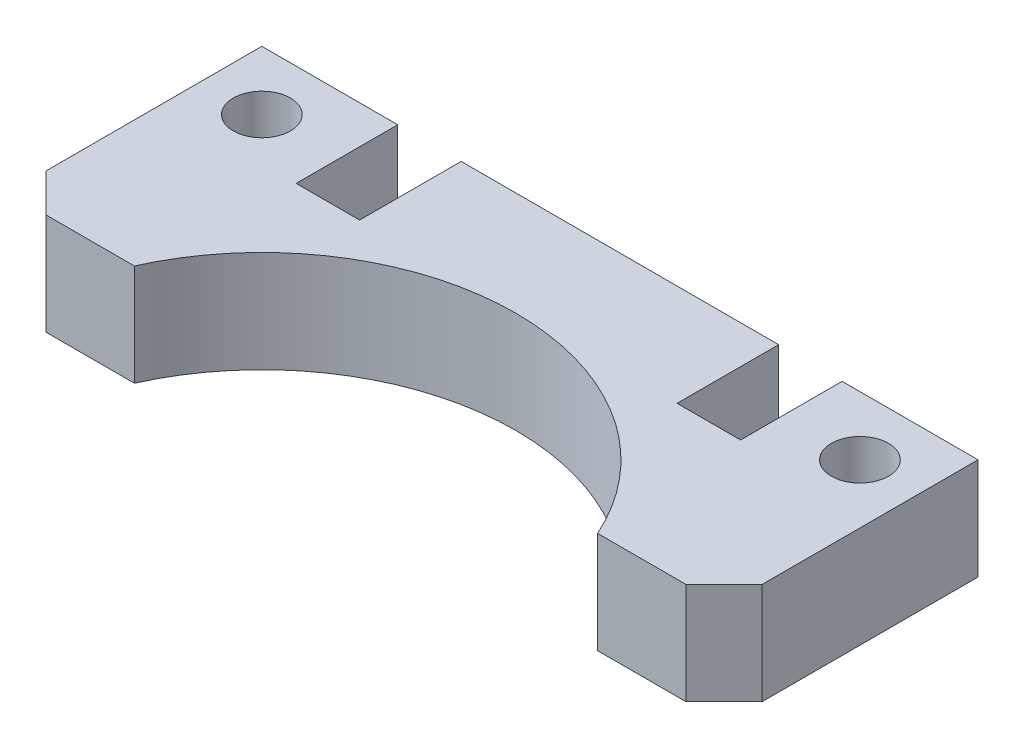
ISO-10303-21;
HEADER;
FILE_DESCRIPTION(('STEP AP214'),'2;1');
FILE_NAME('part.step','',(''),(''),'','','');
FILE_SCHEMA(('AUTOMOTIVE_DESIGN { 1 0 10303 214 1 1 1 1 }'));
ENDSEC;
DATA;
#1=APPLICATION_CONTEXT('core data for automotive mechanical design processes');
#2=APPLICATION_PROTOCOL_DEFINITION('international standard','automotive_design',2000,#1);
#3=PRODUCT_CONTEXT('',#1,'mechanical');
#4=PRODUCT('Part','Part','',(#3));
#5=PRODUCT_RELATED_PRODUCT_CATEGORY('part','',(#4));
#6=PRODUCT_DEFINITION_FORMATION('','',#4);
#7=PRODUCT_DEFINITION_CONTEXT('part definition',#1,'design');
#8=PRODUCT_DEFINITION('design','',#6,#7);
#9=PRODUCT_DEFINITION_SHAPE('','',#8);
#10=(LENGTH_UNIT() NAMED_UNIT(*) SI_UNIT(.MILLI.,.METRE.));
#11=(NAMED_UNIT(*) PLANE_ANGLE_UNIT() SI_UNIT($,.RADIAN.));
#12=(NAMED_UNIT(*) SI_UNIT($,.STERADIAN.) SOLID_ANGLE_UNIT());
#13=UNCERTAINTY_MEASURE_WITH_UNIT(LENGTH_MEASURE(1.E-05),#10,'distance_accuracy_value','');
#14=(GEOMETRIC_REPRESENTATION_CONTEXT(3) GLOBAL_UNCERTAINTY_ASSIGNED_CONTEXT((#13)) GLOBAL_UNIT_ASSIGNED_CONTEXT((#10,
#11,#12)) REPRESENTATION_CONTEXT('',''));
#15=CARTESIAN_POINT('',(0.,0.,0.));
#16=DIRECTION('',(0.,0.,1.));
#17=DIRECTION('',(1.,0.,0.));
#18=AXIS2_PLACEMENT_3D('',#15,#16,#17);
#19=CARTESIAN_POINT('',(0.,8.,-20.));
#20=DIRECTION('',(0.,0.,1.));
#21=DIRECTION('',(1.,0.,0.));
#22=AXIS2_PLACEMENT_3D('',#19,#20,#21);
#23=PLANE('',#22);
#24=DIRECTION('',(-1.,0.,0.));
#25=VECTOR('',#24,1.);
#26=CARTESIAN_POINT('',(0.,8.,-20.));
#27=LINE('',#26,#25);
#28=CARTESIAN_POINT('',(40.7,8.,-20.));
#29=VERTEX_POINT('',#28);
#30=CARTESIAN_POINT('',(15.7,8.,-20.));
#31=VERTEX_POINT('',#30);
#32=EDGE_CURVE('E247',#29,#31,#27,.T.);
#33=ORIENTED_EDGE('',*,*,#32,.F.);
#34=DIRECTION('',(0.,1.,0.));
#35=VECTOR('',#34,1.);
#36=CARTESIAN_POINT('',(40.7,0.,-20.));
#37=LINE('',#36,#35);
#38=CARTESIAN_POINT('',(40.7,0.,-20.));
#39=VERTEX_POINT('',#38);
#40=EDGE_CURVE('E177',#39,#29,#37,.T.);
#41=ORIENTED_EDGE('',*,*,#40,.F.);
#42=DIRECTION('',(-1.,0.,0.));
#43=VECTOR('',#42,1.);
#44=CARTESIAN_POINT('',(0.,0.,-20.));
#45=LINE('',#44,#43);
#46=CARTESIAN_POINT('',(15.7,0.,-20.));
#47=VERTEX_POINT('',#46);
#48=EDGE_CURVE('E168',#39,#47,#45,.T.);
#49=ORIENTED_EDGE('',*,*,#48,.T.);
#50=DIRECTION('',(0.,1.,0.));
#51=VECTOR('',#50,1.);
#52=CARTESIAN_POINT('',(15.7,0.,-20.));
#53=LINE('',#52,#51);
#54=EDGE_CURVE('E203',#47,#31,#53,.T.);
#55=ORIENTED_EDGE('',*,*,#54,.T.);
#56=EDGE_LOOP('',(#33,#41,#49,#55));
#57=FACE_BOUND('',#56,.T.);
#58=ADVANCED_FACE('F35',(#57),#23,.F.);
#59=CARTESIAN_POINT('',(10.7,8.,-20.));
#60=VERTEX_POINT('',#59);
#61=CARTESIAN_POINT('',(0.,8.,-20.));
#62=VERTEX_POINT('',#61);
#63=EDGE_CURVE('E242',#60,#62,#27,.T.);
#64=ORIENTED_EDGE('',*,*,#63,.F.);
#65=DIRECTION('',(0.,1.,0.));
#66=VECTOR('',#65,1.);
#67=CARTESIAN_POINT('',(10.7,0.,-20.));
#68=LINE('',#67,#66);
#69=CARTESIAN_POINT('',(10.7,0.,-20.));
#70=VERTEX_POINT('',#69);
#71=EDGE_CURVE('E200',#70,#60,#68,.T.);
#72=ORIENTED_EDGE('',*,*,#71,.F.);
#73=CARTESIAN_POINT('',(0.,0.,-20.));
#74=VERTEX_POINT('',#73);
#75=EDGE_CURVE('E256',#70,#74,#45,.T.);
#76=ORIENTED_EDGE('',*,*,#75,.T.);
#77=DIRECTION('',(0.,-1.,0.));
#78=VECTOR('',#77,1.);
#79=CARTESIAN_POINT('',(0.,8.,-20.));
#80=LINE('',#79,#78);
#81=EDGE_CURVE('E246',#62,#74,#80,.T.);
#82=ORIENTED_EDGE('',*,*,#81,.F.);
#83=EDGE_LOOP('',(#64,#72,#76,#82));
#84=FACE_BOUND('',#83,.T.);
#85=ADVANCED_FACE('F310',(#84),#23,.F.);
#86=CARTESIAN_POINT('',(0.,8.,0.));
#87=DIRECTION('',(0.,0.,-1.));
#88=DIRECTION('',(-1.,0.,0.));
#89=AXIS2_PLACEMENT_3D('',#86,#87,#88);
#90=PLANE('',#89);
#91=DIRECTION('',(1.,0.,0.));
#92=VECTOR('',#91,1.);
#93=CARTESIAN_POINT('',(0.,0.,0.));
#94=LINE('',#93,#92);
#95=CARTESIAN_POINT('',(3.,0.,0.));
#96=VERTEX_POINT('',#95);
#97=CARTESIAN_POINT('',(9.95828955388229,0.,0.));
#98=VERTEX_POINT('',#97);
#99=EDGE_CURVE('E251',#96,#98,#94,.T.);
#100=ORIENTED_EDGE('',*,*,#99,.T.);
#101=DIRECTION('',(0.,1.,0.));
#102=VECTOR('',#101,1.);
#103=CARTESIAN_POINT('',(9.95828955388229,0.,0.));
#104=LINE('',#103,#102);
#105=CARTESIAN_POINT('',(9.95828955388229,8.,0.));
#106=VERTEX_POINT('',#105);
#107=EDGE_CURVE('E216',#98,#106,#104,.T.);
#108=ORIENTED_EDGE('',*,*,#107,.T.);
#109=DIRECTION('',(1.,0.,0.));
#110=VECTOR('',#109,1.);
#111=CARTESIAN_POINT('',(0.,8.,0.));
#112=LINE('',#111,#110);
#113=CARTESIAN_POINT('',(3.,8.,0.));
#114=VERTEX_POINT('',#113);
#115=EDGE_CURVE('E237',#114,#106,#112,.T.);
#116=ORIENTED_EDGE('',*,*,#115,.F.);
#117=DIRECTION('',(0.,-1.,0.));
#118=VECTOR('',#117,1.);
#119=CARTESIAN_POINT('',(3.,8.,0.));
#120=LINE('',#119,#118);
#121=EDGE_CURVE('E272',#114,#96,#120,.T.);
#122=ORIENTED_EDGE('',*,*,#121,.T.);
#123=EDGE_LOOP('',(#100,#108,#116,#122));
#124=FACE_BOUND('',#123,.T.);
#125=ADVANCED_FACE('F316',(#124),#90,.F.);
#126=CARTESIAN_POINT('',(0.,8.,0.));
#127=DIRECTION('',(1.,0.,0.));
#128=DIRECTION('',(0.,0.,-1.));
#129=AXIS2_PLACEMENT_3D('',#126,#127,#128);
#130=PLANE('',#129);
#131=DIRECTION('',(0.,0.,1.));
#132=VECTOR('',#131,1.);
#133=CARTESIAN_POINT('',(0.,0.,0.));
#134=LINE('',#133,#132);
#135=CARTESIAN_POINT('',(0.,0.,-3.00000000000001));
#136=VERTEX_POINT('',#135);
#137=EDGE_CURVE('E229',#74,#136,#134,.T.);
#138=ORIENTED_EDGE('',*,*,#137,.T.);
#139=DIRECTION('',(0.,1.,0.));
#140=VECTOR('',#139,1.);
#141=CARTESIAN_POINT('',(0.,8.,-3.00000000000001));
#142=LINE('',#141,#140);
#143=CARTESIAN_POINT('',(0.,8.,-3.00000000000001));
#144=VERTEX_POINT('',#143);
#145=EDGE_CURVE('E11',#136,#144,#142,.T.);
#146=ORIENTED_EDGE('',*,*,#145,.T.);
#147=DIRECTION('',(0.,0.,1.));
#148=VECTOR('',#147,1.);
#149=CARTESIAN_POINT('',(0.,8.,0.));
#150=LINE('',#149,#148);
#151=EDGE_CURVE('E232',#62,#144,#150,.T.);
#152=ORIENTED_EDGE('',*,*,#151,.F.);
#153=ORIENTED_EDGE('',*,*,#81,.T.);
#154=EDGE_LOOP('',(#138,#146,#152,#153));
#155=FACE_BOUND('',#154,.T.);
#156=ADVANCED_FACE('F332',(#155),#130,.F.);
#157=CARTESIAN_POINT('',(46.4417104461177,8.,0.));
#158=VERTEX_POINT('',#157);
#159=CARTESIAN_POINT('',(53.4,8.,0.));
#160=VERTEX_POINT('',#159);
#161=EDGE_CURVE('E235',#158,#160,#112,.T.);
#162=ORIENTED_EDGE('',*,*,#161,.F.);
#163=DIRECTION('',(0.,1.,0.));
#164=VECTOR('',#163,1.);
#165=CARTESIAN_POINT('',(46.4417104461177,0.,0.));
#166=LINE('',#165,#164);
#167=CARTESIAN_POINT('',(46.4417104461177,0.,0.));
#168=VERTEX_POINT('',#167);
#169=EDGE_CURVE('E212',#158,#168,#166,.F.);
#170=ORIENTED_EDGE('',*,*,#169,.T.);
#171=CARTESIAN_POINT('',(53.4,0.,0.));
#172=VERTEX_POINT('',#171);
#173=EDGE_CURVE('E250',#168,#172,#94,.T.);
#174=ORIENTED_EDGE('',*,*,#173,.T.);
#175=DIRECTION('',(0.,1.,0.));
#176=VECTOR('',#175,1.);
#177=CARTESIAN_POINT('',(53.4,8.,0.));
#178=LINE('',#177,#176);
#179=EDGE_CURVE('E275',#172,#160,#178,.T.);
#180=ORIENTED_EDGE('',*,*,#179,.T.);
#181=EDGE_LOOP('',(#162,#170,#174,#180));
#182=FACE_BOUND('',#181,.T.);
#183=ADVANCED_FACE('F328',(#182),#90,.F.);
#184=CARTESIAN_POINT('',(56.4,8.,0.));
#185=DIRECTION('',(-1.,0.,0.));
#186=DIRECTION('',(0.,0.,1.));
#187=AXIS2_PLACEMENT_3D('',#184,#185,#186);
#188=PLANE('',#187);
#189=DIRECTION('',(0.,0.,-1.));
#190=VECTOR('',#189,1.);
#191=CARTESIAN_POINT('',(56.4,8.,0.));
#192=LINE('',#191,#190);
#193=CARTESIAN_POINT('',(56.4,8.,-3.));
#194=VERTEX_POINT('',#193);
#195=CARTESIAN_POINT('',(56.4,8.,-20.));
#196=VERTEX_POINT('',#195);
#197=EDGE_CURVE('E240',#194,#196,#192,.T.);
#198=ORIENTED_EDGE('',*,*,#197,.F.);
#199=DIRECTION('',(0.,-1.,0.));
#200=VECTOR('',#199,1.);
#201=CARTESIAN_POINT('',(56.4,8.,-3.));
#202=LINE('',#201,#200);
#203=CARTESIAN_POINT('',(56.4,0.,-3.00000000000001));
#204=VERTEX_POINT('',#203);
#205=EDGE_CURVE('E264',#194,#204,#202,.T.);
#206=ORIENTED_EDGE('',*,*,#205,.T.);
#207=DIRECTION('',(0.,0.,-1.));
#208=VECTOR('',#207,1.);
#209=CARTESIAN_POINT('',(56.4,0.,0.));
#210=LINE('',#209,#208);
#211=CARTESIAN_POINT('',(56.4,0.,-20.));
#212=VERTEX_POINT('',#211);
#213=EDGE_CURVE('E254',#204,#212,#210,.T.);
#214=ORIENTED_EDGE('',*,*,#213,.T.);
#215=DIRECTION('',(0.,-1.,0.));
#216=VECTOR('',#215,1.);
#217=CARTESIAN_POINT('',(56.4,8.,-20.));
#218=LINE('',#217,#216);
#219=EDGE_CURVE('E261',#196,#212,#218,.T.);
#220=ORIENTED_EDGE('',*,*,#219,.F.);
#221=EDGE_LOOP('',(#198,#206,#214,#220));
#222=FACE_BOUND('',#221,.T.);
#223=ADVANCED_FACE('F290',(#222),#188,.F.);
#224=CARTESIAN_POINT('',(45.7,0.,-20.));
#225=VERTEX_POINT('',#224);
#226=EDGE_CURVE('E236',#212,#225,#45,.T.);
#227=ORIENTED_EDGE('',*,*,#226,.T.);
#228=DIRECTION('',(0.,1.,0.));
#229=VECTOR('',#228,1.);
#230=CARTESIAN_POINT('',(45.7,0.,-20.));
#231=LINE('',#230,#229);
#232=CARTESIAN_POINT('',(45.7,8.,-20.));
#233=VERTEX_POINT('',#232);
#234=EDGE_CURVE('E180',#225,#233,#231,.T.);
#235=ORIENTED_EDGE('',*,*,#234,.T.);
#236=EDGE_CURVE('E243',#196,#233,#27,.T.);
#237=ORIENTED_EDGE('',*,*,#236,.F.);
#238=ORIENTED_EDGE('',*,*,#219,.T.);
#239=EDGE_LOOP('',(#227,#235,#237,#238));
#240=FACE_BOUND('',#239,.T.);
#241=ADVANCED_FACE('F297',(#240),#23,.F.);
#242=CARTESIAN_POINT('',(0.,8.,0.));
#243=DIRECTION('',(0.,-1.,0.));
#244=DIRECTION('',(0.,0.,-1.));
#245=AXIS2_PLACEMENT_3D('',#242,#243,#244);
#246=PLANE('',#245);
#247=CARTESIAN_POINT('',(4.65,8.,-15.35));
#248=DIRECTION('',(0.,1.,0.));
#249=DIRECTION('',(0.,0.,1.));
#250=AXIS2_PLACEMENT_3D('',#247,#248,#249);
#251=CIRCLE('',#250,2.25);
#252=CARTESIAN_POINT('',(4.65,8.,-13.1));
#253=VERTEX_POINT('',#252);
#254=EDGE_CURVE('E219',#253,#253,#251,.T.);
#255=ORIENTED_EDGE('',*,*,#254,.F.);
#256=EDGE_LOOP('',(#255));
#257=FACE_BOUND('',#256,.T.);
#258=CARTESIAN_POINT('',(51.75,8.,-15.35));
#259=DIRECTION('',(0.,1.,0.));
#260=DIRECTION('',(0.,0.,1.));
#261=AXIS2_PLACEMENT_3D('',#258,#259,#260);
#262=CIRCLE('',#261,2.25);
#263=CARTESIAN_POINT('',(51.75,8.,-13.1));
#264=VERTEX_POINT('',#263);
#265=EDGE_CURVE('E223',#264,#264,#262,.T.);
#266=ORIENTED_EDGE('',*,*,#265,.F.);
#267=EDGE_LOOP('',(#266));
#268=FACE_BOUND('',#267,.T.);
#269=DIRECTION('',(1.,0.,0.));
#270=VECTOR('',#269,1.);
#271=CARTESIAN_POINT('',(40.7,8.,-12.));
#272=LINE('',#271,#270);
#273=CARTESIAN_POINT('',(40.7,8.,-12.));
#274=VERTEX_POINT('',#273);
#275=CARTESIAN_POINT('',(45.7,8.,-12.));
#276=VERTEX_POINT('',#275);
#277=EDGE_CURVE('E171',#274,#276,#272,.T.);
#278=ORIENTED_EDGE('',*,*,#277,.F.);
#279=DIRECTION('',(0.,0.,1.));
#280=VECTOR('',#279,1.);
#281=CARTESIAN_POINT('',(40.7,8.,-20.));
#282=LINE('',#281,#280);
#283=EDGE_CURVE('E154',#29,#274,#282,.T.);
#284=ORIENTED_EDGE('',*,*,#283,.F.);
#285=ORIENTED_EDGE('',*,*,#32,.T.);
#286=DIRECTION('',(0.,0.,-1.));
#287=VECTOR('',#286,1.);
#288=CARTESIAN_POINT('',(15.7,8.,-20.));
#289=LINE('',#288,#287);
#290=CARTESIAN_POINT('',(15.7,8.,-12.));
#291=VERTEX_POINT('',#290);
#292=EDGE_CURVE('E188',#291,#31,#289,.T.);
#293=ORIENTED_EDGE('',*,*,#292,.F.);
#294=DIRECTION('',(1.,0.,0.));
#295=VECTOR('',#294,1.);
#296=CARTESIAN_POINT('',(10.7,8.,-12.));
#297=LINE('',#296,#295);
#298=CARTESIAN_POINT('',(10.7,8.,-12.));
#299=VERTEX_POINT('',#298);
#300=EDGE_CURVE('E195',#299,#291,#297,.T.);
#301=ORIENTED_EDGE('',*,*,#300,.F.);
#302=DIRECTION('',(0.,0.,1.));
#303=VECTOR('',#302,1.);
#304=CARTESIAN_POINT('',(10.7,8.,-20.));
#305=LINE('',#304,#303);
#306=EDGE_CURVE('E179',#60,#299,#305,.T.);
#307=ORIENTED_EDGE('',*,*,#306,.F.);
#308=ORIENTED_EDGE('',*,*,#63,.T.);
#309=ORIENTED_EDGE('',*,*,#151,.T.);
#310=DIRECTION('',(-0.707106781186547,0.,-0.707106781186548));
#311=VECTOR('',#310,1.);
#312=CARTESIAN_POINT('',(3.,8.,0.));
#313=LINE('',#312,#311);
#314=EDGE_CURVE('E278',#144,#114,#313,.F.);
#315=ORIENTED_EDGE('',*,*,#314,.T.);
#316=ORIENTED_EDGE('',*,*,#115,.T.);
#317=CARTESIAN_POINT('',(28.2,8.,8.2));
#318=DIRECTION('',(0.,1.,0.));
#319=DIRECTION('',(0.,0.,1.));
#320=AXIS2_PLACEMENT_3D('',#317,#318,#319);
#321=CIRCLE('',#320,20.);
#322=EDGE_CURVE('E202',#158,#106,#321,.T.);
#323=ORIENTED_EDGE('',*,*,#322,.F.);
#324=ORIENTED_EDGE('',*,*,#161,.T.);
#325=DIRECTION('',(-0.707106781186548,0.,0.707106781186547));
#326=VECTOR('',#325,1.);
#327=CARTESIAN_POINT('',(56.4,8.,-3.));
#328=LINE('',#327,#326);
#329=EDGE_CURVE('E43',#160,#194,#328,.F.);
#330=ORIENTED_EDGE('',*,*,#329,.T.);
#331=ORIENTED_EDGE('',*,*,#197,.T.);
#332=ORIENTED_EDGE('',*,*,#236,.T.);
#333=DIRECTION('',(0.,0.,-1.));
#334=VECTOR('',#333,1.);
#335=CARTESIAN_POINT('',(45.7,8.,-20.));
#336=LINE('',#335,#334);
#337=EDGE_CURVE('E169',#276,#233,#336,.T.);
#338=ORIENTED_EDGE('',*,*,#337,.F.);
#339=EDGE_LOOP('',(#278,#284,#285,#293,#301,#307,#308,#309,#315,#316,#323,#324,#330,#331,#332,#338));
#340=FACE_BOUND('',#339,.T.);
#341=ADVANCED_FACE('F282',(#257,#268,#340),#246,.F.);
#342=CARTESIAN_POINT('',(0.,0.,0.));
#343=DIRECTION('',(0.,-1.,0.));
#344=DIRECTION('',(0.,0.,-1.));
#345=AXIS2_PLACEMENT_3D('',#342,#343,#344);
#346=PLANE('',#345);
#347=DIRECTION('',(0.,0.,1.));
#348=VECTOR('',#347,1.);
#349=CARTESIAN_POINT('',(40.7,0.,-20.));
#350=LINE('',#349,#348);
#351=CARTESIAN_POINT('',(40.7,0.,-12.));
#352=VERTEX_POINT('',#351);
#353=EDGE_CURVE('E151',#39,#352,#350,.T.);
#354=ORIENTED_EDGE('',*,*,#353,.T.);
#355=DIRECTION('',(1.,0.,0.));
#356=VECTOR('',#355,1.);
#357=CARTESIAN_POINT('',(40.7,0.,-12.));
#358=LINE('',#357,#356);
#359=CARTESIAN_POINT('',(45.7,0.,-12.));
#360=VERTEX_POINT('',#359);
#361=EDGE_CURVE('E161',#352,#360,#358,.T.);
#362=ORIENTED_EDGE('',*,*,#361,.T.);
#363=DIRECTION('',(0.,0.,-1.));
#364=VECTOR('',#363,1.);
#365=CARTESIAN_POINT('',(45.7,0.,-20.));
#366=LINE('',#365,#364);
#367=EDGE_CURVE('E50',#360,#225,#366,.T.);
#368=ORIENTED_EDGE('',*,*,#367,.T.);
#369=ORIENTED_EDGE('',*,*,#226,.F.);
#370=ORIENTED_EDGE('',*,*,#213,.F.);
#371=DIRECTION('',(0.707106781186548,0.,-0.707106781186547));
#372=VECTOR('',#371,1.);
#373=CARTESIAN_POINT('',(26.6999999999999,0.,26.7));
#374=LINE('',#373,#372);
#375=EDGE_CURVE('E269',#204,#172,#374,.F.);
#376=ORIENTED_EDGE('',*,*,#375,.T.);
#377=ORIENTED_EDGE('',*,*,#173,.F.);
#378=CARTESIAN_POINT('',(28.2,0.,8.2));
#379=DIRECTION('',(0.,1.,0.));
#380=DIRECTION('',(0.,0.,1.));
#381=AXIS2_PLACEMENT_3D('',#378,#379,#380);
#382=CIRCLE('',#381,20.);
#383=EDGE_CURVE('E209',#168,#98,#382,.T.);
#384=ORIENTED_EDGE('',*,*,#383,.T.);
#385=ORIENTED_EDGE('',*,*,#99,.F.);
#386=DIRECTION('',(0.707106781186547,0.,0.707106781186548));
#387=VECTOR('',#386,1.);
#388=CARTESIAN_POINT('',(1.5,0.,-1.5));
#389=LINE('',#388,#387);
#390=EDGE_CURVE('E267',#96,#136,#389,.F.);
#391=ORIENTED_EDGE('',*,*,#390,.T.);
#392=ORIENTED_EDGE('',*,*,#137,.F.);
#393=ORIENTED_EDGE('',*,*,#75,.F.);
#394=DIRECTION('',(0.,0.,1.));
#395=VECTOR('',#394,1.);
#396=CARTESIAN_POINT('',(10.7,0.,-20.));
#397=LINE('',#396,#395);
#398=CARTESIAN_POINT('',(10.7,0.,-12.));
#399=VERTEX_POINT('',#398);
#400=EDGE_CURVE('E184',#70,#399,#397,.T.);
#401=ORIENTED_EDGE('',*,*,#400,.T.);
#402=DIRECTION('',(1.,0.,0.));
#403=VECTOR('',#402,1.);
#404=CARTESIAN_POINT('',(10.7,0.,-12.));
#405=LINE('',#404,#403);
#406=CARTESIAN_POINT('',(15.7,0.,-12.));
#407=VERTEX_POINT('',#406);
#408=EDGE_CURVE('E187',#399,#407,#405,.T.);
#409=ORIENTED_EDGE('',*,*,#408,.T.);
#410=DIRECTION('',(0.,0.,-1.));
#411=VECTOR('',#410,1.);
#412=CARTESIAN_POINT('',(15.7,0.,-20.));
#413=LINE('',#412,#411);
#414=EDGE_CURVE('E58',#407,#47,#413,.T.);
#415=ORIENTED_EDGE('',*,*,#414,.T.);
#416=ORIENTED_EDGE('',*,*,#48,.F.);
#417=EDGE_LOOP('',(#354,#362,#368,#369,#370,#376,#377,#384,#385,#391,#392,#393,#401,#409,#415,#416));
#418=FACE_BOUND('',#417,.T.);
#419=CARTESIAN_POINT('',(4.65,0.,-15.35));
#420=DIRECTION('',(0.,1.,0.));
#421=DIRECTION('',(0.,0.,1.));
#422=AXIS2_PLACEMENT_3D('',#419,#420,#421);
#423=CIRCLE('',#422,2.25);
#424=CARTESIAN_POINT('',(4.65,0.,-13.1));
#425=VERTEX_POINT('',#424);
#426=EDGE_CURVE('E220',#425,#425,#423,.T.);
#427=ORIENTED_EDGE('',*,*,#426,.T.);
#428=EDGE_LOOP('',(#427));
#429=FACE_BOUND('',#428,.T.);
#430=CARTESIAN_POINT('',(51.75,0.,-15.35));
#431=DIRECTION('',(0.,1.,0.));
#432=DIRECTION('',(0.,0.,1.));
#433=AXIS2_PLACEMENT_3D('',#430,#431,#432);
#434=CIRCLE('',#433,2.25);
#435=CARTESIAN_POINT('',(51.75,0.,-13.1));
#436=VERTEX_POINT('',#435);
#437=EDGE_CURVE('E226',#436,#436,#434,.T.);
#438=ORIENTED_EDGE('',*,*,#437,.T.);
#439=EDGE_LOOP('',(#438));
#440=FACE_BOUND('',#439,.T.);
#441=ADVANCED_FACE('F166',(#418,#429,#440),#346,.T.);
#442=CARTESIAN_POINT('',(51.75,0.,-15.35));
#443=DIRECTION('',(0.,1.,0.));
#444=DIRECTION('',(0.,0.,1.));
#445=AXIS2_PLACEMENT_3D('',#442,#443,#444);
#446=CYLINDRICAL_SURFACE('',#445,2.25);
#447=ORIENTED_EDGE('',*,*,#437,.F.);
#448=EDGE_LOOP('',(#447));
#449=FACE_BOUND('',#448,.T.);
#450=ORIENTED_EDGE('',*,*,#265,.T.);
#451=EDGE_LOOP('',(#450));
#452=FACE_BOUND('',#451,.T.);
#453=ADVANCED_FACE('F346',(#449,#452),#446,.F.);
#454=CARTESIAN_POINT('',(4.65,0.,-15.35));
#455=DIRECTION('',(0.,1.,0.));
#456=DIRECTION('',(0.,0.,1.));
#457=AXIS2_PLACEMENT_3D('',#454,#455,#456);
#458=CYLINDRICAL_SURFACE('',#457,2.25);
#459=ORIENTED_EDGE('',*,*,#426,.F.);
#460=EDGE_LOOP('',(#459));
#461=FACE_BOUND('',#460,.T.);
#462=ORIENTED_EDGE('',*,*,#254,.T.);
#463=EDGE_LOOP('',(#462));
#464=FACE_BOUND('',#463,.T.);
#465=ADVANCED_FACE('F339',(#461,#464),#458,.F.);
#466=CARTESIAN_POINT('',(56.4,8.,-3.));
#467=DIRECTION('',(-0.707106781186547,0.,-0.707106781186548));
#468=DIRECTION('',(0.,-1.,0.));
#469=AXIS2_PLACEMENT_3D('',#466,#467,#468);
#470=PLANE('',#469);
#471=ORIENTED_EDGE('',*,*,#329,.F.);
#472=ORIENTED_EDGE('',*,*,#179,.F.);
#473=ORIENTED_EDGE('',*,*,#375,.F.);
#474=ORIENTED_EDGE('',*,*,#205,.F.);
#475=EDGE_LOOP('',(#471,#472,#473,#474));
#476=FACE_BOUND('',#475,.T.);
#477=ADVANCED_FACE('F293',(#476),#470,.F.);
#478=CARTESIAN_POINT('',(3.,8.,0.));
#479=DIRECTION('',(0.707106781186548,0.,-0.707106781186547));
#480=DIRECTION('',(0.,-1.,0.));
#481=AXIS2_PLACEMENT_3D('',#478,#479,#480);
#482=PLANE('',#481);
#483=ORIENTED_EDGE('',*,*,#314,.F.);
#484=ORIENTED_EDGE('',*,*,#145,.F.);
#485=ORIENTED_EDGE('',*,*,#390,.F.);
#486=ORIENTED_EDGE('',*,*,#121,.F.);
#487=EDGE_LOOP('',(#483,#484,#485,#486));
#488=FACE_BOUND('',#487,.T.);
#489=ADVANCED_FACE('F37',(#488),#482,.F.);
#490=CARTESIAN_POINT('',(28.2,0.,8.2));
#491=DIRECTION('',(0.,1.,0.));
#492=DIRECTION('',(0.,0.,1.));
#493=AXIS2_PLACEMENT_3D('',#490,#491,#492);
#494=CYLINDRICAL_SURFACE('',#493,20.);
#495=ORIENTED_EDGE('',*,*,#383,.F.);
#496=ORIENTED_EDGE('',*,*,#169,.F.);
#497=ORIENTED_EDGE('',*,*,#322,.T.);
#498=ORIENTED_EDGE('',*,*,#107,.F.);
#499=EDGE_LOOP('',(#495,#496,#497,#498));
#500=FACE_BOUND('',#499,.T.);
#501=ADVANCED_FACE('F344',(#500),#494,.F.);
#502=CARTESIAN_POINT('',(10.7,0.,-20.));
#503=DIRECTION('',(-1.,0.,0.));
#504=DIRECTION('',(0.,0.,1.));
#505=AXIS2_PLACEMENT_3D('',#502,#503,#504);
#506=PLANE('',#505);
#507=ORIENTED_EDGE('',*,*,#306,.T.);
#508=DIRECTION('',(0.,1.,0.));
#509=VECTOR('',#508,1.);
#510=CARTESIAN_POINT('',(10.7,0.,-12.));
#511=LINE('',#510,#509);
#512=EDGE_CURVE('E192',#399,#299,#511,.T.);
#513=ORIENTED_EDGE('',*,*,#512,.F.);
#514=ORIENTED_EDGE('',*,*,#400,.F.);
#515=ORIENTED_EDGE('',*,*,#71,.T.);
#516=EDGE_LOOP('',(#507,#513,#514,#515));
#517=FACE_BOUND('',#516,.T.);
#518=ADVANCED_FACE('F415',(#517),#506,.F.);
#519=CARTESIAN_POINT('',(15.7,0.,-20.));
#520=DIRECTION('',(1.,0.,0.));
#521=DIRECTION('',(0.,0.,-1.));
#522=AXIS2_PLACEMENT_3D('',#519,#520,#521);
#523=PLANE('',#522);
#524=ORIENTED_EDGE('',*,*,#292,.T.);
#525=ORIENTED_EDGE('',*,*,#54,.F.);
#526=ORIENTED_EDGE('',*,*,#414,.F.);
#527=DIRECTION('',(0.,1.,0.));
#528=VECTOR('',#527,1.);
#529=CARTESIAN_POINT('',(15.7,0.,-12.));
#530=LINE('',#529,#528);
#531=EDGE_CURVE('E206',#407,#291,#530,.T.);
#532=ORIENTED_EDGE('',*,*,#531,.T.);
#533=EDGE_LOOP('',(#524,#525,#526,#532));
#534=FACE_BOUND('',#533,.T.);
#535=ADVANCED_FACE('F444',(#534),#523,.F.);
#536=CARTESIAN_POINT('',(10.7,0.,-12.));
#537=DIRECTION('',(0.,0.,1.));
#538=DIRECTION('',(1.,0.,0.));
#539=AXIS2_PLACEMENT_3D('',#536,#537,#538);
#540=PLANE('',#539);
#541=ORIENTED_EDGE('',*,*,#300,.T.);
#542=ORIENTED_EDGE('',*,*,#531,.F.);
#543=ORIENTED_EDGE('',*,*,#408,.F.);
#544=ORIENTED_EDGE('',*,*,#512,.T.);
#545=EDGE_LOOP('',(#541,#542,#543,#544));
#546=FACE_BOUND('',#545,.T.);
#547=ADVANCED_FACE('F307',(#546),#540,.F.);
#548=CARTESIAN_POINT('',(40.7,0.,-20.));
#549=DIRECTION('',(-1.,0.,0.));
#550=DIRECTION('',(0.,0.,1.));
#551=AXIS2_PLACEMENT_3D('',#548,#549,#550);
#552=PLANE('',#551);
#553=ORIENTED_EDGE('',*,*,#283,.T.);
#554=DIRECTION('',(0.,1.,0.));
#555=VECTOR('',#554,1.);
#556=CARTESIAN_POINT('',(40.7,0.,-12.));
#557=LINE('',#556,#555);
#558=EDGE_CURVE('E147',#352,#274,#557,.T.);
#559=ORIENTED_EDGE('',*,*,#558,.F.);
#560=ORIENTED_EDGE('',*,*,#353,.F.);
#561=ORIENTED_EDGE('',*,*,#40,.T.);
#562=EDGE_LOOP('',(#553,#559,#560,#561));
#563=FACE_BOUND('',#562,.T.);
#564=ADVANCED_FACE('F149',(#563),#552,.F.);
#565=CARTESIAN_POINT('',(45.7,0.,-20.));
#566=DIRECTION('',(1.,0.,0.));
#567=DIRECTION('',(0.,0.,-1.));
#568=AXIS2_PLACEMENT_3D('',#565,#566,#567);
#569=PLANE('',#568);
#570=ORIENTED_EDGE('',*,*,#337,.T.);
#571=ORIENTED_EDGE('',*,*,#234,.F.);
#572=ORIENTED_EDGE('',*,*,#367,.F.);
#573=DIRECTION('',(0.,1.,0.));
#574=VECTOR('',#573,1.);
#575=CARTESIAN_POINT('',(45.7,0.,-12.));
#576=LINE('',#575,#574);
#577=EDGE_CURVE('E158',#360,#276,#576,.T.);
#578=ORIENTED_EDGE('',*,*,#577,.T.);
#579=EDGE_LOOP('',(#570,#571,#572,#578));
#580=FACE_BOUND('',#579,.T.);
#581=ADVANCED_FACE('F299',(#580),#569,.F.);
#582=CARTESIAN_POINT('',(40.7,0.,-12.));
#583=DIRECTION('',(0.,0.,1.));
#584=DIRECTION('',(1.,0.,0.));
#585=AXIS2_PLACEMENT_3D('',#582,#583,#584);
#586=PLANE('',#585);
#587=ORIENTED_EDGE('',*,*,#277,.T.);
#588=ORIENTED_EDGE('',*,*,#577,.F.);
#589=ORIENTED_EDGE('',*,*,#361,.F.);
#590=ORIENTED_EDGE('',*,*,#558,.T.);
#591=EDGE_LOOP('',(#587,#588,#589,#590));
#592=FACE_BOUND('',#591,.T.);
#593=ADVANCED_FACE('F162',(#592),#586,.F.);
#594=CLOSED_SHELL('',(#58,#85,#125,#156,#183,#223,#241,#341,#441,#453,#465,#477,#489,#501,#518,
#535,#547,#564,#581,#593));
#595=MANIFOLD_SOLID_BREP('B2',#594);
#596=ADVANCED_BREP_SHAPE_REPRESENTATION('',(#18,#595),#14);
#597=SHAPE_DEFINITION_REPRESENTATION(#9,#596);
ENDSEC;
END-ISO-10303-21;
